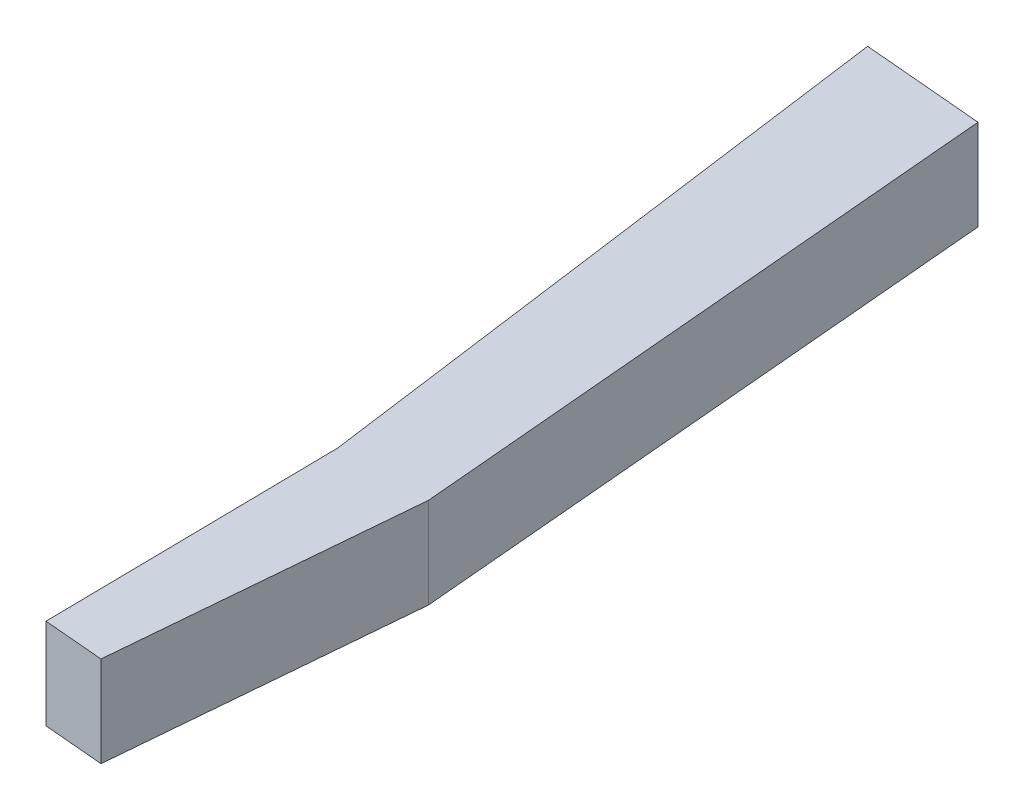
ISO-10303-21;
HEADER;
FILE_DESCRIPTION(('STEP AP214'),'2;1');
FILE_NAME('part.step','',(''),(''),'','','');
FILE_SCHEMA(('AUTOMOTIVE_DESIGN { 1 0 10303 214 1 1 1 1 }'));
ENDSEC;
DATA;
#1=APPLICATION_CONTEXT('core data for automotive mechanical design processes');
#2=APPLICATION_PROTOCOL_DEFINITION('international standard','automotive_design',2000,#1);
#3=PRODUCT_CONTEXT('',#1,'mechanical');
#4=PRODUCT('Part','Part','',(#3));
#5=PRODUCT_RELATED_PRODUCT_CATEGORY('part','',(#4));
#6=PRODUCT_DEFINITION_FORMATION('','',#4);
#7=PRODUCT_DEFINITION_CONTEXT('part definition',#1,'design');
#8=PRODUCT_DEFINITION('design','',#6,#7);
#9=PRODUCT_DEFINITION_SHAPE('','',#8);
#10=(LENGTH_UNIT() NAMED_UNIT(*) SI_UNIT(.MILLI.,.METRE.));
#11=(NAMED_UNIT(*) PLANE_ANGLE_UNIT() SI_UNIT($,.RADIAN.));
#12=(NAMED_UNIT(*) SI_UNIT($,.STERADIAN.) SOLID_ANGLE_UNIT());
#13=UNCERTAINTY_MEASURE_WITH_UNIT(LENGTH_MEASURE(1.E-05),#10,'distance_accuracy_value','');
#14=(GEOMETRIC_REPRESENTATION_CONTEXT(3) GLOBAL_UNCERTAINTY_ASSIGNED_CONTEXT((#13)) GLOBAL_UNIT_ASSIGNED_CONTEXT((#10,
#11,#12)) REPRESENTATION_CONTEXT('',''));
#15=CARTESIAN_POINT('',(0.,0.,0.));
#16=DIRECTION('',(0.,0.,1.));
#17=DIRECTION('',(1.,0.,0.));
#18=AXIS2_PLACEMENT_3D('',#15,#16,#17);
#19=CARTESIAN_POINT('',(0.680265881699449,15.,48.9381774771106));
#20=DIRECTION('',(-0.999903401836681,0.,0.0138991724729196));
#21=DIRECTION('',(0.0138991724729196,0.,0.999903401836681));
#22=AXIS2_PLACEMENT_3D('',#19,#20,#21);
#23=PLANE('',#22);
#24=DIRECTION('',(-0.0138991724729196,0.,-0.999903401836681));
#25=VECTOR('',#24,1.);
#26=CARTESIAN_POINT('',(0.680265881699449,0.,48.9381774771106));
#27=LINE('',#26,#25);
#28=CARTESIAN_POINT('',(0.680265881699449,0.,48.9381774771106));
#29=VERTEX_POINT('',#28);
#30=CARTESIAN_POINT('',(0.,0.,0.));
#31=VERTEX_POINT('',#30);
#32=EDGE_CURVE('E122',#29,#31,#27,.T.);
#33=ORIENTED_EDGE('',*,*,#32,.F.);
#34=DIRECTION('',(0.,-1.,0.));
#35=VECTOR('',#34,1.);
#36=CARTESIAN_POINT('',(0.680265881699449,15.,48.9381774771106));
#37=LINE('',#36,#35);
#38=CARTESIAN_POINT('',(0.680265881699449,15.,48.9381774771106));
#39=VERTEX_POINT('',#38);
#40=EDGE_CURVE('E11',#39,#29,#37,.T.);
#41=ORIENTED_EDGE('',*,*,#40,.F.);
#42=DIRECTION('',(-0.0138991724729196,0.,-0.999903401836681));
#43=VECTOR('',#42,1.);
#44=CARTESIAN_POINT('',(0.680265881699449,15.,48.9381774771106));
#45=LINE('',#44,#43);
#46=CARTESIAN_POINT('',(0.,15.,0.));
#47=VERTEX_POINT('',#46);
#48=EDGE_CURVE('E136',#39,#47,#45,.T.);
#49=ORIENTED_EDGE('',*,*,#48,.T.);
#50=DIRECTION('',(0.,-1.,0.));
#51=VECTOR('',#50,1.);
#52=CARTESIAN_POINT('',(0.,15.,0.));
#53=LINE('',#52,#51);
#54=EDGE_CURVE('E40',#47,#31,#53,.T.);
#55=ORIENTED_EDGE('',*,*,#54,.T.);
#56=EDGE_LOOP('',(#33,#41,#49,#55));
#57=FACE_BOUND('',#56,.T.);
#58=ADVANCED_FACE('F37',(#57),#23,.T.);
#59=CARTESIAN_POINT('',(10.6422128626169,15.,49.8097349045873));
#60=DIRECTION('',(-0.0871557427476619,0.,0.996194698091745));
#61=DIRECTION('',(0.996194698091745,0.,0.0871557427476619));
#62=AXIS2_PLACEMENT_3D('',#59,#60,#61);
#63=PLANE('',#62);
#64=DIRECTION('',(-0.996194698091745,0.,-0.0871557427476619));
#65=VECTOR('',#64,1.);
#66=CARTESIAN_POINT('',(10.6422128626169,0.,49.8097349045873));
#67=LINE('',#66,#65);
#68=CARTESIAN_POINT('',(10.6422128626169,0.,49.8097349045873));
#69=VERTEX_POINT('',#68);
#70=EDGE_CURVE('E134',#69,#29,#67,.T.);
#71=ORIENTED_EDGE('',*,*,#70,.F.);
#72=DIRECTION('',(0.,-1.,0.));
#73=VECTOR('',#72,1.);
#74=CARTESIAN_POINT('',(10.6422128626169,15.,49.8097349045873));
#75=LINE('',#74,#73);
#76=CARTESIAN_POINT('',(10.6422128626169,15.,49.8097349045873));
#77=VERTEX_POINT('',#76);
#78=EDGE_CURVE('E46',#77,#69,#75,.T.);
#79=ORIENTED_EDGE('',*,*,#78,.F.);
#80=DIRECTION('',(-0.996194698091745,0.,-0.0871557427476619));
#81=VECTOR('',#80,1.);
#82=CARTESIAN_POINT('',(10.6422128626169,15.,49.8097349045873));
#83=LINE('',#82,#81);
#84=EDGE_CURVE('E112',#77,#39,#83,.T.);
#85=ORIENTED_EDGE('',*,*,#84,.T.);
#86=ORIENTED_EDGE('',*,*,#40,.T.);
#87=EDGE_LOOP('',(#71,#79,#85,#86));
#88=FACE_BOUND('',#87,.T.);
#89=ADVANCED_FACE('F144',(#88),#63,.T.);
#90=CARTESIAN_POINT('',(15.,15.,0.));
#91=DIRECTION('',(0.996194698091745,0.,0.087155742747662));
#92=DIRECTION('',(0.087155742747662,0.,-0.996194698091745));
#93=AXIS2_PLACEMENT_3D('',#90,#91,#92);
#94=PLANE('',#93);
#95=DIRECTION('',(-0.087155742747662,0.,0.996194698091745));
#96=VECTOR('',#95,1.);
#97=CARTESIAN_POINT('',(15.,0.,0.));
#98=LINE('',#97,#96);
#99=CARTESIAN_POINT('',(15.,0.,0.));
#100=VERTEX_POINT('',#99);
#101=EDGE_CURVE('E99',#100,#69,#98,.T.);
#102=ORIENTED_EDGE('',*,*,#101,.F.);
#103=DIRECTION('',(0.,-1.,0.));
#104=VECTOR('',#103,1.);
#105=CARTESIAN_POINT('',(15.,15.,0.));
#106=LINE('',#105,#104);
#107=CARTESIAN_POINT('',(15.,15.,0.));
#108=VERTEX_POINT('',#107);
#109=EDGE_CURVE('E94',#108,#100,#106,.T.);
#110=ORIENTED_EDGE('',*,*,#109,.F.);
#111=DIRECTION('',(-0.087155742747662,0.,0.996194698091745));
#112=VECTOR('',#111,1.);
#113=CARTESIAN_POINT('',(15.,15.,0.));
#114=LINE('',#113,#112);
#115=EDGE_CURVE('E97',#108,#77,#114,.T.);
#116=ORIENTED_EDGE('',*,*,#115,.T.);
#117=ORIENTED_EDGE('',*,*,#78,.T.);
#118=EDGE_LOOP('',(#102,#110,#116,#117));
#119=FACE_BOUND('',#118,.T.);
#120=ADVANCED_FACE('F96',(#119),#94,.T.);
#121=CARTESIAN_POINT('',(6.2844257252345,15.,-99.6194698091746));
#122=DIRECTION('',(0.996194698091746,0.,-0.087155742747655));
#123=DIRECTION('',(-0.087155742747655,0.,-0.996194698091746));
#124=AXIS2_PLACEMENT_3D('',#121,#122,#123);
#125=PLANE('',#124);
#126=DIRECTION('',(0.087155742747655,0.,0.996194698091746));
#127=VECTOR('',#126,1.);
#128=CARTESIAN_POINT('',(6.2844257252345,0.,-99.6194698091746));
#129=LINE('',#128,#127);
#130=CARTESIAN_POINT('',(6.2844257252345,0.,-99.6194698091746));
#131=VERTEX_POINT('',#130);
#132=EDGE_CURVE('E131',#131,#100,#129,.T.);
#133=ORIENTED_EDGE('',*,*,#132,.F.);
#134=DIRECTION('',(0.,-1.,0.));
#135=VECTOR('',#134,1.);
#136=CARTESIAN_POINT('',(6.2844257252345,15.,-99.6194698091746));
#137=LINE('',#136,#135);
#138=CARTESIAN_POINT('',(6.2844257252345,15.,-99.6194698091746));
#139=VERTEX_POINT('',#138);
#140=EDGE_CURVE('E104',#139,#131,#137,.T.);
#141=ORIENTED_EDGE('',*,*,#140,.F.);
#142=DIRECTION('',(0.087155742747655,0.,0.996194698091746));
#143=VECTOR('',#142,1.);
#144=CARTESIAN_POINT('',(6.2844257252345,15.,-99.6194698091746));
#145=LINE('',#144,#143);
#146=EDGE_CURVE('E110',#139,#108,#145,.T.);
#147=ORIENTED_EDGE('',*,*,#146,.T.);
#148=ORIENTED_EDGE('',*,*,#109,.T.);
#149=EDGE_LOOP('',(#133,#141,#147,#148));
#150=FACE_BOUND('',#149,.T.);
#151=ADVANCED_FACE('F114',(#150),#125,.T.);
#152=CARTESIAN_POINT('',(-13.7155742747655,15.,-101.369243079693));
#153=DIRECTION('',(0.0871557427476616,0.,-0.996194698091745));
#154=DIRECTION('',(-0.996194698091745,0.,-0.0871557427476616));
#155=AXIS2_PLACEMENT_3D('',#152,#153,#154);
#156=PLANE('',#155);
#157=DIRECTION('',(0.996194698091745,0.,0.0871557427476616));
#158=VECTOR('',#157,1.);
#159=CARTESIAN_POINT('',(-13.7155742747655,0.,-101.369243079693));
#160=LINE('',#159,#158);
#161=CARTESIAN_POINT('',(-13.7155742747655,0.,-101.369243079693));
#162=VERTEX_POINT('',#161);
#163=EDGE_CURVE('E128',#162,#131,#160,.T.);
#164=ORIENTED_EDGE('',*,*,#163,.F.);
#165=DIRECTION('',(0.,-1.,0.));
#166=VECTOR('',#165,1.);
#167=CARTESIAN_POINT('',(-13.7155742747655,15.,-101.369243079693));
#168=LINE('',#167,#166);
#169=CARTESIAN_POINT('',(-13.7155742747655,15.,-101.369243079693));
#170=VERTEX_POINT('',#169);
#171=EDGE_CURVE('E139',#170,#162,#168,.T.);
#172=ORIENTED_EDGE('',*,*,#171,.F.);
#173=DIRECTION('',(0.996194698091745,0.,0.0871557427476616));
#174=VECTOR('',#173,1.);
#175=CARTESIAN_POINT('',(-13.7155742747655,15.,-101.369243079693));
#176=LINE('',#175,#174);
#177=EDGE_CURVE('E115',#170,#139,#176,.T.);
#178=ORIENTED_EDGE('',*,*,#177,.T.);
#179=ORIENTED_EDGE('',*,*,#140,.T.);
#180=EDGE_LOOP('',(#164,#172,#178,#179));
#181=FACE_BOUND('',#180,.T.);
#182=ADVANCED_FACE('F157',(#181),#156,.T.);
#183=CARTESIAN_POINT('',(0.,15.,0.));
#184=DIRECTION('',(-0.990970325446396,0.,0.134081371132102));
#185=DIRECTION('',(0.134081371132102,0.,0.990970325446396));
#186=AXIS2_PLACEMENT_3D('',#183,#184,#185);
#187=PLANE('',#186);
#188=DIRECTION('',(-0.134081371132102,0.,-0.990970325446396));
#189=VECTOR('',#188,1.);
#190=CARTESIAN_POINT('',(0.,0.,0.));
#191=LINE('',#190,#189);
#192=EDGE_CURVE('E125',#31,#162,#191,.T.);
#193=ORIENTED_EDGE('',*,*,#192,.F.);
#194=ORIENTED_EDGE('',*,*,#54,.F.);
#195=DIRECTION('',(-0.134081371132102,0.,-0.990970325446396));
#196=VECTOR('',#195,1.);
#197=CARTESIAN_POINT('',(0.,15.,0.));
#198=LINE('',#197,#196);
#199=EDGE_CURVE('E117',#47,#170,#198,.T.);
#200=ORIENTED_EDGE('',*,*,#199,.T.);
#201=ORIENTED_EDGE('',*,*,#171,.T.);
#202=EDGE_LOOP('',(#193,#194,#200,#201));
#203=FACE_BOUND('',#202,.T.);
#204=ADVANCED_FACE('F141',(#203),#187,.T.);
#205=CARTESIAN_POINT('',(0.,15.,0.));
#206=DIRECTION('',(0.,-1.,0.));
#207=DIRECTION('',(0.,0.,-1.));
#208=AXIS2_PLACEMENT_3D('',#205,#206,#207);
#209=PLANE('',#208);
#210=ORIENTED_EDGE('',*,*,#48,.F.);
#211=ORIENTED_EDGE('',*,*,#84,.F.);
#212=ORIENTED_EDGE('',*,*,#115,.F.);
#213=ORIENTED_EDGE('',*,*,#146,.F.);
#214=ORIENTED_EDGE('',*,*,#177,.F.);
#215=ORIENTED_EDGE('',*,*,#199,.F.);
#216=EDGE_LOOP('',(#210,#211,#212,#213,#214,#215));
#217=FACE_BOUND('',#216,.T.);
#218=ADVANCED_FACE('F108',(#217),#209,.F.);
#219=CARTESIAN_POINT('',(0.,0.,0.));
#220=DIRECTION('',(0.,-1.,0.));
#221=DIRECTION('',(0.,0.,-1.));
#222=AXIS2_PLACEMENT_3D('',#219,#220,#221);
#223=PLANE('',#222);
#224=ORIENTED_EDGE('',*,*,#32,.T.);
#225=ORIENTED_EDGE('',*,*,#192,.T.);
#226=ORIENTED_EDGE('',*,*,#163,.T.);
#227=ORIENTED_EDGE('',*,*,#132,.T.);
#228=ORIENTED_EDGE('',*,*,#101,.T.);
#229=ORIENTED_EDGE('',*,*,#70,.T.);
#230=EDGE_LOOP('',(#224,#225,#226,#227,#228,#229));
#231=FACE_BOUND('',#230,.T.);
#232=ADVANCED_FACE('F143',(#231),#223,.T.);
#233=CLOSED_SHELL('',(#58,#89,#120,#151,#182,#204,#218,#232));
#234=MANIFOLD_SOLID_BREP('B2',#233);
#235=ADVANCED_BREP_SHAPE_REPRESENTATION('',(#18,#234),#14);
#236=SHAPE_DEFINITION_REPRESENTATION(#9,#235);
ENDSEC;
END-ISO-10303-21;
